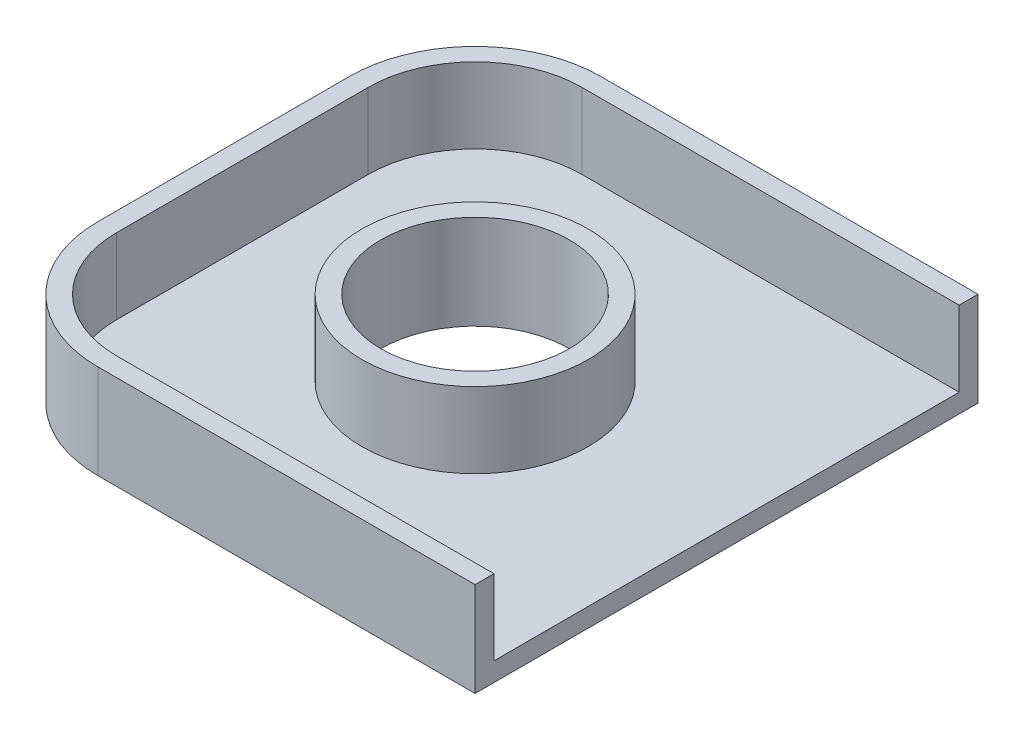
ISO-10303-21;
HEADER;
FILE_DESCRIPTION(('STEP AP214'),'2;1');
FILE_NAME('part.step','',(''),(''),'','','');
FILE_SCHEMA(('AUTOMOTIVE_DESIGN { 1 0 10303 214 1 1 1 1 }'));
ENDSEC;
DATA;
#1=APPLICATION_CONTEXT('core data for automotive mechanical design processes');
#2=APPLICATION_PROTOCOL_DEFINITION('international standard','automotive_design',2000,#1);
#3=PRODUCT_CONTEXT('',#1,'mechanical');
#4=PRODUCT('Part','Part','',(#3));
#5=PRODUCT_RELATED_PRODUCT_CATEGORY('part','',(#4));
#6=PRODUCT_DEFINITION_FORMATION('','',#4);
#7=PRODUCT_DEFINITION_CONTEXT('part definition',#1,'design');
#8=PRODUCT_DEFINITION('design','',#6,#7);
#9=PRODUCT_DEFINITION_SHAPE('','',#8);
#10=(LENGTH_UNIT() NAMED_UNIT(*) SI_UNIT(.MILLI.,.METRE.));
#11=(NAMED_UNIT(*) PLANE_ANGLE_UNIT() SI_UNIT($,.RADIAN.));
#12=(NAMED_UNIT(*) SI_UNIT($,.STERADIAN.) SOLID_ANGLE_UNIT());
#13=UNCERTAINTY_MEASURE_WITH_UNIT(LENGTH_MEASURE(1.E-05),#10,'distance_accuracy_value','');
#14=(GEOMETRIC_REPRESENTATION_CONTEXT(3) GLOBAL_UNCERTAINTY_ASSIGNED_CONTEXT((#13)) GLOBAL_UNIT_ASSIGNED_CONTEXT((#10,
#11,#12)) REPRESENTATION_CONTEXT('',''));
#15=CARTESIAN_POINT('',(0.,0.,0.));
#16=DIRECTION('',(0.,0.,1.));
#17=DIRECTION('',(1.,0.,0.));
#18=AXIS2_PLACEMENT_3D('',#15,#16,#17);
#19=CARTESIAN_POINT('',(80.,15.,0.));
#20=DIRECTION('',(-1.,0.,0.));
#21=DIRECTION('',(0.,0.,1.));
#22=AXIS2_PLACEMENT_3D('',#19,#20,#21);
#23=PLANE('',#22);
#24=DIRECTION('',(0.,0.,-1.));
#25=VECTOR('',#24,1.);
#26=CARTESIAN_POINT('',(80.,15.,0.));
#27=LINE('',#26,#25);
#28=CARTESIAN_POINT('',(80.,15.,-77.));
#29=VERTEX_POINT('',#28);
#30=CARTESIAN_POINT('',(80.,15.,-80.));
#31=VERTEX_POINT('',#30);
#32=EDGE_CURVE('E182',#29,#31,#27,.T.);
#33=ORIENTED_EDGE('',*,*,#32,.F.);
#34=DIRECTION('',(0.,-1.,0.));
#35=VECTOR('',#34,1.);
#36=CARTESIAN_POINT('',(80.,15.,-77.));
#37=LINE('',#36,#35);
#38=CARTESIAN_POINT('',(80.,3.,-77.));
#39=VERTEX_POINT('',#38);
#40=EDGE_CURVE('E162',#29,#39,#37,.T.);
#41=ORIENTED_EDGE('',*,*,#40,.T.);
#42=DIRECTION('',(0.,0.,-1.));
#43=VECTOR('',#42,1.);
#44=CARTESIAN_POINT('',(80.,3.,0.));
#45=LINE('',#44,#43);
#46=CARTESIAN_POINT('',(80.,3.,-3.));
#47=VERTEX_POINT('',#46);
#48=EDGE_CURVE('E140',#47,#39,#45,.T.);
#49=ORIENTED_EDGE('',*,*,#48,.F.);
#50=DIRECTION('',(0.,-1.,0.));
#51=VECTOR('',#50,1.);
#52=CARTESIAN_POINT('',(80.,15.,-3.));
#53=LINE('',#52,#51);
#54=CARTESIAN_POINT('',(80.,15.,-3.));
#55=VERTEX_POINT('',#54);
#56=EDGE_CURVE('E172',#55,#47,#53,.T.);
#57=ORIENTED_EDGE('',*,*,#56,.F.);
#58=CARTESIAN_POINT('',(80.,15.,0.));
#59=VERTEX_POINT('',#58);
#60=EDGE_CURVE('E178',#59,#55,#27,.T.);
#61=ORIENTED_EDGE('',*,*,#60,.F.);
#62=DIRECTION('',(0.,-1.,0.));
#63=VECTOR('',#62,1.);
#64=CARTESIAN_POINT('',(80.,15.,0.));
#65=LINE('',#64,#63);
#66=CARTESIAN_POINT('',(80.,0.,0.));
#67=VERTEX_POINT('',#66);
#68=EDGE_CURVE('E189',#59,#67,#65,.T.);
#69=ORIENTED_EDGE('',*,*,#68,.T.);
#70=DIRECTION('',(0.,0.,-1.));
#71=VECTOR('',#70,1.);
#72=CARTESIAN_POINT('',(80.,0.,0.));
#73=LINE('',#72,#71);
#74=CARTESIAN_POINT('',(80.,0.,-80.));
#75=VERTEX_POINT('',#74);
#76=EDGE_CURVE('E164',#67,#75,#73,.T.);
#77=ORIENTED_EDGE('',*,*,#76,.T.);
#78=DIRECTION('',(0.,-1.,0.));
#79=VECTOR('',#78,1.);
#80=CARTESIAN_POINT('',(80.,15.,-80.));
#81=LINE('',#80,#79);
#82=EDGE_CURVE('E202',#31,#75,#81,.T.);
#83=ORIENTED_EDGE('',*,*,#82,.F.);
#84=EDGE_LOOP('',(#33,#41,#49,#57,#61,#69,#77,#83));
#85=FACE_BOUND('',#84,.T.);
#86=ADVANCED_FACE('F32',(#85),#23,.F.);
#87=CARTESIAN_POINT('',(80.,15.,-80.));
#88=DIRECTION('',(0.,0.,1.));
#89=DIRECTION('',(1.,0.,0.));
#90=AXIS2_PLACEMENT_3D('',#87,#88,#89);
#91=PLANE('',#90);
#92=DIRECTION('',(-1.,0.,0.));
#93=VECTOR('',#92,1.);
#94=CARTESIAN_POINT('',(80.,0.,-80.));
#95=LINE('',#94,#93);
#96=CARTESIAN_POINT('',(20.,0.,-80.));
#97=VERTEX_POINT('',#96);
#98=EDGE_CURVE('E192',#75,#97,#95,.T.);
#99=ORIENTED_EDGE('',*,*,#98,.T.);
#100=DIRECTION('',(0.,-1.,0.));
#101=VECTOR('',#100,1.);
#102=CARTESIAN_POINT('',(20.,15.,-80.));
#103=LINE('',#102,#101);
#104=CARTESIAN_POINT('',(20.,15.,-80.));
#105=VERTEX_POINT('',#104);
#106=EDGE_CURVE('E214',#97,#105,#103,.F.);
#107=ORIENTED_EDGE('',*,*,#106,.T.);
#108=DIRECTION('',(-1.,0.,0.));
#109=VECTOR('',#108,1.);
#110=CARTESIAN_POINT('',(80.,15.,-80.));
#111=LINE('',#110,#109);
#112=EDGE_CURVE('E181',#31,#105,#111,.T.);
#113=ORIENTED_EDGE('',*,*,#112,.F.);
#114=ORIENTED_EDGE('',*,*,#82,.T.);
#115=EDGE_LOOP('',(#99,#107,#113,#114));
#116=FACE_BOUND('',#115,.T.);
#117=ADVANCED_FACE('F233',(#116),#91,.F.);
#118=CARTESIAN_POINT('',(0.,15.,-80.));
#119=DIRECTION('',(1.,0.,0.));
#120=DIRECTION('',(0.,0.,-1.));
#121=AXIS2_PLACEMENT_3D('',#118,#119,#120);
#122=PLANE('',#121);
#123=DIRECTION('',(0.,0.,1.));
#124=VECTOR('',#123,1.);
#125=CARTESIAN_POINT('',(0.,15.,-80.));
#126=LINE('',#125,#124);
#127=CARTESIAN_POINT('',(0.,15.,-60.));
#128=VERTEX_POINT('',#127);
#129=CARTESIAN_POINT('',(0.,15.,-20.));
#130=VERTEX_POINT('',#129);
#131=EDGE_CURVE('E185',#128,#130,#126,.T.);
#132=ORIENTED_EDGE('',*,*,#131,.F.);
#133=DIRECTION('',(0.,-1.,0.));
#134=VECTOR('',#133,1.);
#135=CARTESIAN_POINT('',(0.,15.,-60.));
#136=LINE('',#135,#134);
#137=CARTESIAN_POINT('',(0.,0.,-60.));
#138=VERTEX_POINT('',#137);
#139=EDGE_CURVE('E207',#128,#138,#136,.T.);
#140=ORIENTED_EDGE('',*,*,#139,.T.);
#141=DIRECTION('',(0.,0.,1.));
#142=VECTOR('',#141,1.);
#143=CARTESIAN_POINT('',(0.,0.,-80.));
#144=LINE('',#143,#142);
#145=CARTESIAN_POINT('',(0.,0.,-20.));
#146=VERTEX_POINT('',#145);
#147=EDGE_CURVE('E195',#138,#146,#144,.T.);
#148=ORIENTED_EDGE('',*,*,#147,.T.);
#149=DIRECTION('',(0.,-1.,0.));
#150=VECTOR('',#149,1.);
#151=CARTESIAN_POINT('',(0.,15.,-20.));
#152=LINE('',#151,#150);
#153=EDGE_CURVE('E205',#146,#130,#152,.F.);
#154=ORIENTED_EDGE('',*,*,#153,.T.);
#155=EDGE_LOOP('',(#132,#140,#148,#154));
#156=FACE_BOUND('',#155,.T.);
#157=ADVANCED_FACE('F225',(#156),#122,.F.);
#158=CARTESIAN_POINT('',(0.,15.,0.));
#159=DIRECTION('',(0.,0.,-1.));
#160=DIRECTION('',(-1.,0.,0.));
#161=AXIS2_PLACEMENT_3D('',#158,#159,#160);
#162=PLANE('',#161);
#163=DIRECTION('',(1.,0.,0.));
#164=VECTOR('',#163,1.);
#165=CARTESIAN_POINT('',(0.,15.,0.));
#166=LINE('',#165,#164);
#167=CARTESIAN_POINT('',(20.,15.,0.));
#168=VERTEX_POINT('',#167);
#169=EDGE_CURVE('E187',#168,#59,#166,.T.);
#170=ORIENTED_EDGE('',*,*,#169,.F.);
#171=DIRECTION('',(0.,-1.,0.));
#172=VECTOR('',#171,1.);
#173=CARTESIAN_POINT('',(20.,15.,0.));
#174=LINE('',#173,#172);
#175=CARTESIAN_POINT('',(20.,0.,0.));
#176=VERTEX_POINT('',#175);
#177=EDGE_CURVE('E11',#168,#176,#174,.T.);
#178=ORIENTED_EDGE('',*,*,#177,.T.);
#179=DIRECTION('',(1.,0.,0.));
#180=VECTOR('',#179,1.);
#181=CARTESIAN_POINT('',(0.,0.,0.));
#182=LINE('',#181,#180);
#183=EDGE_CURVE('E198',#176,#67,#182,.T.);
#184=ORIENTED_EDGE('',*,*,#183,.T.);
#185=ORIENTED_EDGE('',*,*,#68,.F.);
#186=EDGE_LOOP('',(#170,#178,#184,#185));
#187=FACE_BOUND('',#186,.T.);
#188=ADVANCED_FACE('F241',(#187),#162,.F.);
#189=CARTESIAN_POINT('',(0.,15.,0.));
#190=DIRECTION('',(0.,1.,0.));
#191=DIRECTION('',(0.,0.,1.));
#192=AXIS2_PLACEMENT_3D('',#189,#190,#191);
#193=PLANE('',#192);
#194=DIRECTION('',(-1.,0.,0.));
#195=VECTOR('',#194,1.);
#196=CARTESIAN_POINT('',(80.,15.,-77.));
#197=LINE('',#196,#195);
#198=CARTESIAN_POINT('',(20.,15.,-77.));
#199=VERTEX_POINT('',#198);
#200=EDGE_CURVE('E147',#29,#199,#197,.T.);
#201=ORIENTED_EDGE('',*,*,#200,.F.);
#202=ORIENTED_EDGE('',*,*,#32,.T.);
#203=ORIENTED_EDGE('',*,*,#112,.T.);
#204=CARTESIAN_POINT('',(20.,15.,-60.));
#205=DIRECTION('',(0.,1.,0.));
#206=DIRECTION('',(0.,0.,1.));
#207=AXIS2_PLACEMENT_3D('',#204,#205,#206);
#208=CIRCLE('',#207,20.);
#209=EDGE_CURVE('E41',#105,#128,#208,.T.);
#210=ORIENTED_EDGE('',*,*,#209,.T.);
#211=ORIENTED_EDGE('',*,*,#131,.T.);
#212=CARTESIAN_POINT('',(20.,15.,-20.));
#213=DIRECTION('',(0.,1.,0.));
#214=DIRECTION('',(0.,0.,1.));
#215=AXIS2_PLACEMENT_3D('',#212,#213,#214);
#216=CIRCLE('',#215,20.);
#217=EDGE_CURVE('E56',#130,#168,#216,.T.);
#218=ORIENTED_EDGE('',*,*,#217,.T.);
#219=ORIENTED_EDGE('',*,*,#169,.T.);
#220=ORIENTED_EDGE('',*,*,#60,.T.);
#221=DIRECTION('',(1.,0.,0.));
#222=VECTOR('',#221,1.);
#223=CARTESIAN_POINT('',(0.,15.,-3.));
#224=LINE('',#223,#222);
#225=CARTESIAN_POINT('',(20.,15.,-3.));
#226=VERTEX_POINT('',#225);
#227=EDGE_CURVE('E169',#226,#55,#224,.T.);
#228=ORIENTED_EDGE('',*,*,#227,.F.);
#229=CARTESIAN_POINT('',(20.,15.,-20.));
#230=DIRECTION('',(0.,1.,0.));
#231=DIRECTION('',(0.,0.,1.));
#232=AXIS2_PLACEMENT_3D('',#229,#230,#231);
#233=CIRCLE('',#232,17.);
#234=CARTESIAN_POINT('',(3.,15.,-20.));
#235=VERTEX_POINT('',#234);
#236=EDGE_CURVE('E149',#235,#226,#233,.T.);
#237=ORIENTED_EDGE('',*,*,#236,.F.);
#238=DIRECTION('',(0.,0.,1.));
#239=VECTOR('',#238,1.);
#240=CARTESIAN_POINT('',(3.,15.,-80.));
#241=LINE('',#240,#239);
#242=CARTESIAN_POINT('',(3.,15.,-60.));
#243=VERTEX_POINT('',#242);
#244=EDGE_CURVE('E166',#243,#235,#241,.T.);
#245=ORIENTED_EDGE('',*,*,#244,.F.);
#246=CARTESIAN_POINT('',(20.,15.,-60.));
#247=DIRECTION('',(0.,1.,0.));
#248=DIRECTION('',(0.,0.,1.));
#249=AXIS2_PLACEMENT_3D('',#246,#247,#248);
#250=CIRCLE('',#249,17.);
#251=EDGE_CURVE('E151',#199,#243,#250,.T.);
#252=ORIENTED_EDGE('',*,*,#251,.F.);
#253=EDGE_LOOP('',(#201,#202,#203,#210,#211,#218,#219,#220,#228,#237,#245,#252));
#254=FACE_BOUND('',#253,.T.);
#255=ADVANCED_FACE('F219',(#254),#193,.T.);
#256=CARTESIAN_POINT('',(0.,0.,0.));
#257=DIRECTION('',(0.,1.,0.));
#258=DIRECTION('',(0.,0.,1.));
#259=AXIS2_PLACEMENT_3D('',#256,#257,#258);
#260=PLANE('',#259);
#261=CARTESIAN_POINT('',(40.,0.,-40.));
#262=DIRECTION('',(0.,1.,0.));
#263=DIRECTION('',(0.,0.,1.));
#264=AXIS2_PLACEMENT_3D('',#261,#262,#263);
#265=CIRCLE('',#264,15.);
#266=CARTESIAN_POINT('',(40.,0.,-25.));
#267=VERTEX_POINT('',#266);
#268=EDGE_CURVE('E300',#267,#267,#265,.F.);
#269=ORIENTED_EDGE('',*,*,#268,.F.);
#270=EDGE_LOOP('',(#269));
#271=FACE_BOUND('',#270,.T.);
#272=ORIENTED_EDGE('',*,*,#147,.F.);
#273=CARTESIAN_POINT('',(20.,0.,-60.));
#274=DIRECTION('',(0.,1.,0.));
#275=DIRECTION('',(0.,0.,1.));
#276=AXIS2_PLACEMENT_3D('',#273,#274,#275);
#277=CIRCLE('',#276,20.);
#278=EDGE_CURVE('E212',#138,#97,#277,.F.);
#279=ORIENTED_EDGE('',*,*,#278,.T.);
#280=ORIENTED_EDGE('',*,*,#98,.F.);
#281=ORIENTED_EDGE('',*,*,#76,.F.);
#282=ORIENTED_EDGE('',*,*,#183,.F.);
#283=CARTESIAN_POINT('',(20.,0.,-20.));
#284=DIRECTION('',(0.,1.,0.));
#285=DIRECTION('',(0.,0.,1.));
#286=AXIS2_PLACEMENT_3D('',#283,#284,#285);
#287=CIRCLE('',#286,20.);
#288=EDGE_CURVE('E210',#176,#146,#287,.F.);
#289=ORIENTED_EDGE('',*,*,#288,.T.);
#290=EDGE_LOOP('',(#272,#279,#280,#281,#282,#289));
#291=FACE_BOUND('',#290,.T.);
#292=ADVANCED_FACE('F230',(#271,#291),#260,.F.);
#293=CARTESIAN_POINT('',(20.,15.,-60.));
#294=DIRECTION('',(0.,-1.,0.));
#295=DIRECTION('',(0.,0.,-1.));
#296=AXIS2_PLACEMENT_3D('',#293,#294,#295);
#297=CYLINDRICAL_SURFACE('',#296,20.);
#298=ORIENTED_EDGE('',*,*,#209,.F.);
#299=ORIENTED_EDGE('',*,*,#106,.F.);
#300=ORIENTED_EDGE('',*,*,#278,.F.);
#301=ORIENTED_EDGE('',*,*,#139,.F.);
#302=EDGE_LOOP('',(#298,#299,#300,#301));
#303=FACE_BOUND('',#302,.T.);
#304=ADVANCED_FACE('F228',(#303),#297,.T.);
#305=CARTESIAN_POINT('',(20.,15.,-20.));
#306=DIRECTION('',(0.,-1.,0.));
#307=DIRECTION('',(0.,0.,-1.));
#308=AXIS2_PLACEMENT_3D('',#305,#306,#307);
#309=CYLINDRICAL_SURFACE('',#308,20.);
#310=ORIENTED_EDGE('',*,*,#217,.F.);
#311=ORIENTED_EDGE('',*,*,#153,.F.);
#312=ORIENTED_EDGE('',*,*,#288,.F.);
#313=ORIENTED_EDGE('',*,*,#177,.F.);
#314=EDGE_LOOP('',(#310,#311,#312,#313));
#315=FACE_BOUND('',#314,.T.);
#316=ADVANCED_FACE('F34',(#315),#309,.T.);
#317=CARTESIAN_POINT('',(80.,15.,-77.));
#318=DIRECTION('',(0.,0.,1.));
#319=DIRECTION('',(1.,0.,0.));
#320=AXIS2_PLACEMENT_3D('',#317,#318,#319);
#321=PLANE('',#320);
#322=DIRECTION('',(-1.,0.,0.));
#323=VECTOR('',#322,1.);
#324=CARTESIAN_POINT('',(80.,3.,-77.));
#325=LINE('',#324,#323);
#326=CARTESIAN_POINT('',(20.,3.,-77.));
#327=VERTEX_POINT('',#326);
#328=EDGE_CURVE('E137',#39,#327,#325,.T.);
#329=ORIENTED_EDGE('',*,*,#328,.F.);
#330=ORIENTED_EDGE('',*,*,#40,.F.);
#331=ORIENTED_EDGE('',*,*,#200,.T.);
#332=DIRECTION('',(0.,1.,0.));
#333=VECTOR('',#332,1.);
#334=CARTESIAN_POINT('',(20.,15.,-77.));
#335=LINE('',#334,#333);
#336=EDGE_CURVE('E127',#327,#199,#335,.T.);
#337=ORIENTED_EDGE('',*,*,#336,.F.);
#338=EDGE_LOOP('',(#329,#330,#331,#337));
#339=FACE_BOUND('',#338,.T.);
#340=ADVANCED_FACE('F145',(#339),#321,.T.);
#341=CARTESIAN_POINT('',(3.,15.,-80.));
#342=DIRECTION('',(1.,0.,0.));
#343=DIRECTION('',(0.,0.,-1.));
#344=AXIS2_PLACEMENT_3D('',#341,#342,#343);
#345=PLANE('',#344);
#346=ORIENTED_EDGE('',*,*,#244,.T.);
#347=DIRECTION('',(0.,1.,0.));
#348=VECTOR('',#347,1.);
#349=CARTESIAN_POINT('',(3.,15.,-20.));
#350=LINE('',#349,#348);
#351=CARTESIAN_POINT('',(3.,3.,-20.));
#352=VERTEX_POINT('',#351);
#353=EDGE_CURVE('E160',#352,#235,#350,.T.);
#354=ORIENTED_EDGE('',*,*,#353,.F.);
#355=DIRECTION('',(0.,0.,1.));
#356=VECTOR('',#355,1.);
#357=CARTESIAN_POINT('',(3.,3.,-80.));
#358=LINE('',#357,#356);
#359=CARTESIAN_POINT('',(3.,3.,-60.));
#360=VERTEX_POINT('',#359);
#361=EDGE_CURVE('E143',#360,#352,#358,.T.);
#362=ORIENTED_EDGE('',*,*,#361,.F.);
#363=DIRECTION('',(0.,1.,0.));
#364=VECTOR('',#363,1.);
#365=CARTESIAN_POINT('',(3.,15.,-60.));
#366=LINE('',#365,#364);
#367=EDGE_CURVE('E130',#243,#360,#366,.F.);
#368=ORIENTED_EDGE('',*,*,#367,.F.);
#369=EDGE_LOOP('',(#346,#354,#362,#368));
#370=FACE_BOUND('',#369,.T.);
#371=ADVANCED_FACE('F249',(#370),#345,.T.);
#372=CARTESIAN_POINT('',(0.,15.,-3.));
#373=DIRECTION('',(0.,0.,-1.));
#374=DIRECTION('',(-1.,0.,0.));
#375=AXIS2_PLACEMENT_3D('',#372,#373,#374);
#376=PLANE('',#375);
#377=ORIENTED_EDGE('',*,*,#227,.T.);
#378=ORIENTED_EDGE('',*,*,#56,.T.);
#379=DIRECTION('',(1.,0.,0.));
#380=VECTOR('',#379,1.);
#381=CARTESIAN_POINT('',(0.,3.,-3.));
#382=LINE('',#381,#380);
#383=CARTESIAN_POINT('',(20.,3.,-3.));
#384=VERTEX_POINT('',#383);
#385=EDGE_CURVE('E155',#384,#47,#382,.T.);
#386=ORIENTED_EDGE('',*,*,#385,.F.);
#387=DIRECTION('',(0.,1.,0.));
#388=VECTOR('',#387,1.);
#389=CARTESIAN_POINT('',(20.,15.,-3.));
#390=LINE('',#389,#388);
#391=EDGE_CURVE('E48',#226,#384,#390,.F.);
#392=ORIENTED_EDGE('',*,*,#391,.F.);
#393=EDGE_LOOP('',(#377,#378,#386,#392));
#394=FACE_BOUND('',#393,.T.);
#395=ADVANCED_FACE('F276',(#394),#376,.T.);
#396=CARTESIAN_POINT('',(0.,3.,0.));
#397=DIRECTION('',(0.,1.,0.));
#398=DIRECTION('',(0.,0.,1.));
#399=AXIS2_PLACEMENT_3D('',#396,#397,#398);
#400=PLANE('',#399);
#401=CARTESIAN_POINT('',(40.,3.,-40.));
#402=DIRECTION('',(0.,1.,0.));
#403=DIRECTION('',(0.,0.,1.));
#404=AXIS2_PLACEMENT_3D('',#401,#402,#403);
#405=CIRCLE('',#404,18.);
#406=CARTESIAN_POINT('',(40.,3.,-22.));
#407=VERTEX_POINT('',#406);
#408=EDGE_CURVE('E301',#407,#407,#405,.T.);
#409=ORIENTED_EDGE('',*,*,#408,.F.);
#410=EDGE_LOOP('',(#409));
#411=FACE_BOUND('',#410,.T.);
#412=ORIENTED_EDGE('',*,*,#361,.T.);
#413=CARTESIAN_POINT('',(20.,3.,-20.));
#414=DIRECTION('',(0.,1.,0.));
#415=DIRECTION('',(0.,0.,1.));
#416=AXIS2_PLACEMENT_3D('',#413,#414,#415);
#417=CIRCLE('',#416,17.);
#418=EDGE_CURVE('E134',#384,#352,#417,.F.);
#419=ORIENTED_EDGE('',*,*,#418,.F.);
#420=ORIENTED_EDGE('',*,*,#385,.T.);
#421=ORIENTED_EDGE('',*,*,#48,.T.);
#422=ORIENTED_EDGE('',*,*,#328,.T.);
#423=CARTESIAN_POINT('',(20.,3.,-60.));
#424=DIRECTION('',(0.,1.,0.));
#425=DIRECTION('',(0.,0.,1.));
#426=AXIS2_PLACEMENT_3D('',#423,#424,#425);
#427=CIRCLE('',#426,17.);
#428=EDGE_CURVE('E123',#360,#327,#427,.F.);
#429=ORIENTED_EDGE('',*,*,#428,.F.);
#430=EDGE_LOOP('',(#412,#419,#420,#421,#422,#429));
#431=FACE_BOUND('',#430,.T.);
#432=ADVANCED_FACE('F138',(#411,#431),#400,.T.);
#433=CARTESIAN_POINT('',(20.,15.,-60.));
#434=DIRECTION('',(0.,-1.,0.));
#435=DIRECTION('',(0.,0.,-1.));
#436=AXIS2_PLACEMENT_3D('',#433,#434,#435);
#437=CYLINDRICAL_SURFACE('',#436,17.);
#438=ORIENTED_EDGE('',*,*,#251,.T.);
#439=ORIENTED_EDGE('',*,*,#367,.T.);
#440=ORIENTED_EDGE('',*,*,#428,.T.);
#441=ORIENTED_EDGE('',*,*,#336,.T.);
#442=EDGE_LOOP('',(#438,#439,#440,#441));
#443=FACE_BOUND('',#442,.T.);
#444=ADVANCED_FACE('F125',(#443),#437,.F.);
#445=CARTESIAN_POINT('',(20.,15.,-20.));
#446=DIRECTION('',(0.,-1.,0.));
#447=DIRECTION('',(0.,0.,-1.));
#448=AXIS2_PLACEMENT_3D('',#445,#446,#447);
#449=CYLINDRICAL_SURFACE('',#448,17.);
#450=ORIENTED_EDGE('',*,*,#236,.T.);
#451=ORIENTED_EDGE('',*,*,#391,.T.);
#452=ORIENTED_EDGE('',*,*,#418,.T.);
#453=ORIENTED_EDGE('',*,*,#353,.T.);
#454=EDGE_LOOP('',(#450,#451,#452,#453));
#455=FACE_BOUND('',#454,.T.);
#456=ADVANCED_FACE('F267',(#455),#449,.F.);
#457=CARTESIAN_POINT('',(40.,15.,-40.));
#458=DIRECTION('',(0.,-1.,0.));
#459=DIRECTION('',(0.,0.,-1.));
#460=AXIS2_PLACEMENT_3D('',#457,#458,#459);
#461=CYLINDRICAL_SURFACE('',#460,18.);
#462=CARTESIAN_POINT('',(40.,15.,-40.));
#463=DIRECTION('',(0.,1.,0.));
#464=DIRECTION('',(0.,0.,1.));
#465=AXIS2_PLACEMENT_3D('',#462,#463,#464);
#466=CIRCLE('',#465,18.);
#467=CARTESIAN_POINT('',(40.,15.,-22.));
#468=VERTEX_POINT('',#467);
#469=EDGE_CURVE('E176',#468,#468,#466,.T.);
#470=ORIENTED_EDGE('',*,*,#469,.F.);
#471=EDGE_LOOP('',(#470));
#472=FACE_BOUND('',#471,.T.);
#473=ORIENTED_EDGE('',*,*,#408,.T.);
#474=EDGE_LOOP('',(#473));
#475=FACE_BOUND('',#474,.T.);
#476=ADVANCED_FACE('F270',(#472,#475),#461,.T.);
#477=CARTESIAN_POINT('',(40.,15.,-40.));
#478=DIRECTION('',(0.,1.,0.));
#479=DIRECTION('',(0.,0.,1.));
#480=AXIS2_PLACEMENT_3D('',#477,#478,#479);
#481=PLANE('',#480);
#482=CARTESIAN_POINT('',(40.,15.,-40.));
#483=DIRECTION('',(0.,1.,0.));
#484=DIRECTION('',(0.,0.,1.));
#485=AXIS2_PLACEMENT_3D('',#482,#483,#484);
#486=CIRCLE('',#485,15.);
#487=CARTESIAN_POINT('',(40.,15.,-25.));
#488=VERTEX_POINT('',#487);
#489=EDGE_CURVE('E36',#488,#488,#486,.F.);
#490=ORIENTED_EDGE('',*,*,#489,.T.);
#491=EDGE_LOOP('',(#490));
#492=FACE_BOUND('',#491,.T.);
#493=ORIENTED_EDGE('',*,*,#469,.T.);
#494=EDGE_LOOP('',(#493));
#495=FACE_BOUND('',#494,.T.);
#496=ADVANCED_FACE('F285',(#492,#495),#481,.T.);
#497=CARTESIAN_POINT('',(40.,18.,-40.));
#498=DIRECTION('',(0.,-1.,0.));
#499=DIRECTION('',(0.,0.,-1.));
#500=AXIS2_PLACEMENT_3D('',#497,#498,#499);
#501=CYLINDRICAL_SURFACE('',#500,15.);
#502=ORIENTED_EDGE('',*,*,#489,.F.);
#503=EDGE_LOOP('',(#502));
#504=FACE_BOUND('',#503,.T.);
#505=ORIENTED_EDGE('',*,*,#268,.T.);
#506=EDGE_LOOP('',(#505));
#507=FACE_BOUND('',#506,.T.);
#508=ADVANCED_FACE('F289',(#504,#507),#501,.F.);
#509=CLOSED_SHELL('',(#86,#117,#157,#188,#255,#292,#304,#316,#340,#371,#395,#432,#444,#456,#476,
#496,#508));
#510=MANIFOLD_SOLID_BREP('B2',#509);
#511=ADVANCED_BREP_SHAPE_REPRESENTATION('',(#18,#510),#14);
#512=SHAPE_DEFINITION_REPRESENTATION(#9,#511);
ENDSEC;
END-ISO-10303-21;
